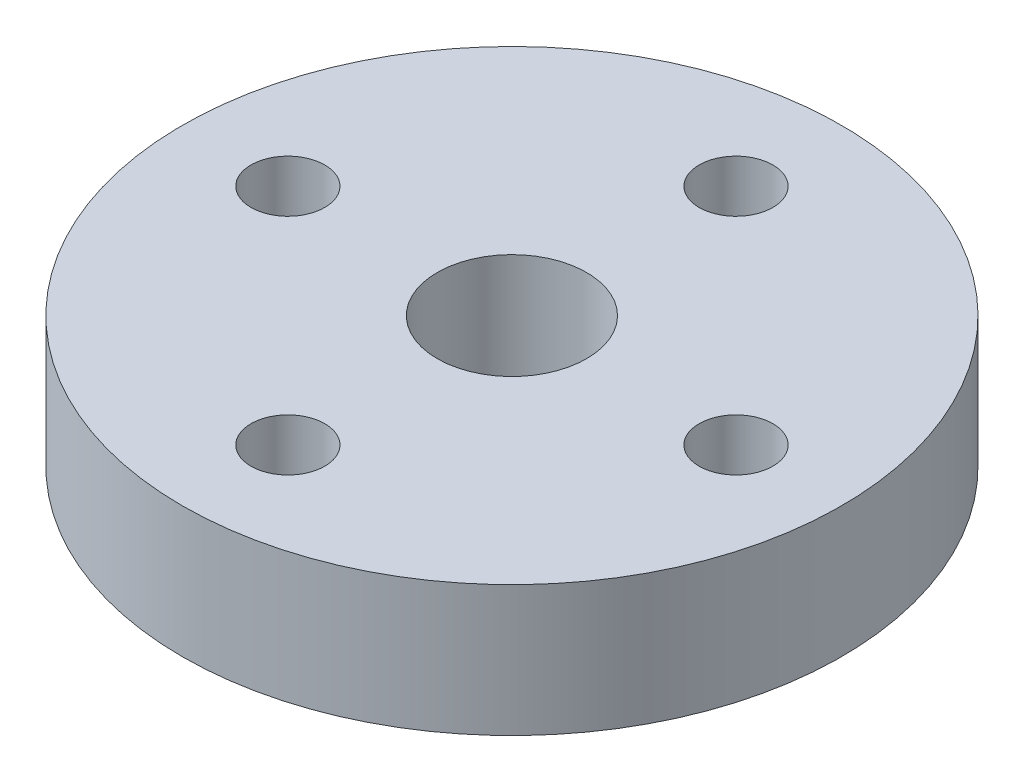
ISO-10303-21;
HEADER;
FILE_DESCRIPTION(('STEP AP214'),'2;1');
FILE_NAME('part.step','',(''),(''),'','','');
FILE_SCHEMA(('AUTOMOTIVE_DESIGN { 1 0 10303 214 1 1 1 1 }'));
ENDSEC;
DATA;
#1=APPLICATION_CONTEXT('core data for automotive mechanical design processes');
#2=APPLICATION_PROTOCOL_DEFINITION('international standard','automotive_design',2000,#1);
#3=PRODUCT_CONTEXT('',#1,'mechanical');
#4=PRODUCT('Part','Part','',(#3));
#5=PRODUCT_RELATED_PRODUCT_CATEGORY('part','',(#4));
#6=PRODUCT_DEFINITION_FORMATION('','',#4);
#7=PRODUCT_DEFINITION_CONTEXT('part definition',#1,'design');
#8=PRODUCT_DEFINITION('design','',#6,#7);
#9=PRODUCT_DEFINITION_SHAPE('','',#8);
#10=(LENGTH_UNIT() NAMED_UNIT(*) SI_UNIT(.MILLI.,.METRE.));
#11=(NAMED_UNIT(*) PLANE_ANGLE_UNIT() SI_UNIT($,.RADIAN.));
#12=(NAMED_UNIT(*) SI_UNIT($,.STERADIAN.) SOLID_ANGLE_UNIT());
#13=UNCERTAINTY_MEASURE_WITH_UNIT(LENGTH_MEASURE(1.E-05),#10,'distance_accuracy_value','');
#14=(GEOMETRIC_REPRESENTATION_CONTEXT(3) GLOBAL_UNCERTAINTY_ASSIGNED_CONTEXT((#13)) GLOBAL_UNIT_ASSIGNED_CONTEXT((#10,
#11,#12)) REPRESENTATION_CONTEXT('',''));
#15=CARTESIAN_POINT('',(0.,0.,0.));
#16=DIRECTION('',(0.,0.,1.));
#17=DIRECTION('',(1.,0.,0.));
#18=AXIS2_PLACEMENT_3D('',#15,#16,#17);
#19=CARTESIAN_POINT('',(0.,7.,0.));
#20=DIRECTION('',(0.,1.,0.));
#21=DIRECTION('',(0.,0.,1.));
#22=AXIS2_PLACEMENT_3D('',#19,#20,#21);
#23=PLANE('',#22);
#24=CARTESIAN_POINT('',(6.78404223294284E-13,7.,12.));
#25=DIRECTION('',(0.,1.,0.));
#26=DIRECTION('',(0.,0.,1.));
#27=AXIS2_PLACEMENT_3D('',#24,#25,#26);
#28=CIRCLE('',#27,1.975);
#29=CARTESIAN_POINT('',(6.78404223294284E-13,7.,13.975));
#30=VERTEX_POINT('',#29);
#31=EDGE_CURVE('E63',#30,#30,#28,.T.);
#32=ORIENTED_EDGE('',*,*,#31,.F.);
#33=EDGE_LOOP('',(#32));
#34=FACE_BOUND('',#33,.T.);
#35=CARTESIAN_POINT('',(0.,7.,-12.));
#36=DIRECTION('',(0.,1.,0.));
#37=DIRECTION('',(0.,0.,1.));
#38=AXIS2_PLACEMENT_3D('',#35,#36,#37);
#39=CIRCLE('',#38,1.975);
#40=CARTESIAN_POINT('',(0.,7.,-10.025));
#41=VERTEX_POINT('',#40);
#42=EDGE_CURVE('E51',#41,#41,#39,.T.);
#43=ORIENTED_EDGE('',*,*,#42,.F.);
#44=EDGE_LOOP('',(#43));
#45=FACE_BOUND('',#44,.T.);
#46=CARTESIAN_POINT('',(0.,7.,0.));
#47=DIRECTION('',(0.,1.,0.));
#48=DIRECTION('',(0.,0.,1.));
#49=AXIS2_PLACEMENT_3D('',#46,#47,#48);
#50=CIRCLE('',#49,17.65);
#51=CARTESIAN_POINT('',(0.,7.,17.65));
#52=VERTEX_POINT('',#51);
#53=EDGE_CURVE('E10',#52,#52,#50,.T.);
#54=ORIENTED_EDGE('',*,*,#53,.T.);
#55=EDGE_LOOP('',(#54));
#56=FACE_BOUND('',#55,.T.);
#57=CARTESIAN_POINT('',(0.,7.,0.));
#58=DIRECTION('',(0.,1.,0.));
#59=DIRECTION('',(0.,0.,1.));
#60=AXIS2_PLACEMENT_3D('',#57,#58,#59);
#61=CIRCLE('',#60,4.);
#62=CARTESIAN_POINT('',(0.,7.,4.));
#63=VERTEX_POINT('',#62);
#64=EDGE_CURVE('E46',#63,#63,#61,.T.);
#65=ORIENTED_EDGE('',*,*,#64,.F.);
#66=EDGE_LOOP('',(#65));
#67=FACE_BOUND('',#66,.T.);
#68=CARTESIAN_POINT('',(12.0000000000003,7.,-3.38856148926383E-13));
#69=DIRECTION('',(0.,1.,0.));
#70=DIRECTION('',(0.,0.,1.));
#71=AXIS2_PLACEMENT_3D('',#68,#69,#70);
#72=CIRCLE('',#71,1.975);
#73=CARTESIAN_POINT('',(12.0000000000003,7.,1.97499999999966));
#74=VERTEX_POINT('',#73);
#75=EDGE_CURVE('E57',#74,#74,#72,.T.);
#76=ORIENTED_EDGE('',*,*,#75,.F.);
#77=EDGE_LOOP('',(#76));
#78=FACE_BOUND('',#77,.T.);
#79=CARTESIAN_POINT('',(-11.9999999999997,7.,3.4032572508536E-13));
#80=DIRECTION('',(0.,1.,0.));
#81=DIRECTION('',(0.,0.,1.));
#82=AXIS2_PLACEMENT_3D('',#79,#80,#81);
#83=CIRCLE('',#82,1.975);
#84=CARTESIAN_POINT('',(-11.9999999999997,7.,1.97500000000034));
#85=VERTEX_POINT('',#84);
#86=EDGE_CURVE('E69',#85,#85,#83,.T.);
#87=ORIENTED_EDGE('',*,*,#86,.F.);
#88=EDGE_LOOP('',(#87));
#89=FACE_BOUND('',#88,.T.);
#90=ADVANCED_FACE('F35',(#34,#45,#56,#67,#78,#89),#23,.T.);
#91=CARTESIAN_POINT('',(0.,0.,0.));
#92=DIRECTION('',(0.,1.,0.));
#93=DIRECTION('',(0.,0.,1.));
#94=AXIS2_PLACEMENT_3D('',#91,#92,#93);
#95=PLANE('',#94);
#96=CARTESIAN_POINT('',(0.,0.,0.));
#97=DIRECTION('',(0.,1.,0.));
#98=DIRECTION('',(0.,0.,1.));
#99=AXIS2_PLACEMENT_3D('',#96,#97,#98);
#100=CIRCLE('',#99,17.65);
#101=CARTESIAN_POINT('',(0.,0.,17.65));
#102=VERTEX_POINT('',#101);
#103=EDGE_CURVE('E39',#102,#102,#100,.T.);
#104=ORIENTED_EDGE('',*,*,#103,.F.);
#105=EDGE_LOOP('',(#104));
#106=FACE_BOUND('',#105,.T.);
#107=CARTESIAN_POINT('',(0.,0.,0.));
#108=DIRECTION('',(0.,1.,0.));
#109=DIRECTION('',(0.,0.,1.));
#110=AXIS2_PLACEMENT_3D('',#107,#108,#109);
#111=CIRCLE('',#110,4.);
#112=CARTESIAN_POINT('',(0.,0.,4.));
#113=VERTEX_POINT('',#112);
#114=EDGE_CURVE('E48',#113,#113,#111,.T.);
#115=ORIENTED_EDGE('',*,*,#114,.T.);
#116=EDGE_LOOP('',(#115));
#117=FACE_BOUND('',#116,.T.);
#118=CARTESIAN_POINT('',(0.,0.,-12.));
#119=DIRECTION('',(0.,1.,0.));
#120=DIRECTION('',(0.,0.,1.));
#121=AXIS2_PLACEMENT_3D('',#118,#119,#120);
#122=CIRCLE('',#121,1.975);
#123=CARTESIAN_POINT('',(0.,0.,-10.025));
#124=VERTEX_POINT('',#123);
#125=EDGE_CURVE('E54',#124,#124,#122,.T.);
#126=ORIENTED_EDGE('',*,*,#125,.T.);
#127=EDGE_LOOP('',(#126));
#128=FACE_BOUND('',#127,.T.);
#129=CARTESIAN_POINT('',(12.0000000000003,0.,-3.38856148926383E-13));
#130=DIRECTION('',(0.,1.,0.));
#131=DIRECTION('',(0.,0.,1.));
#132=AXIS2_PLACEMENT_3D('',#129,#130,#131);
#133=CIRCLE('',#132,1.975);
#134=CARTESIAN_POINT('',(12.0000000000003,0.,1.97499999999966));
#135=VERTEX_POINT('',#134);
#136=EDGE_CURVE('E60',#135,#135,#133,.T.);
#137=ORIENTED_EDGE('',*,*,#136,.T.);
#138=EDGE_LOOP('',(#137));
#139=FACE_BOUND('',#138,.T.);
#140=CARTESIAN_POINT('',(6.78404223294284E-13,0.,12.));
#141=DIRECTION('',(0.,1.,0.));
#142=DIRECTION('',(0.,0.,1.));
#143=AXIS2_PLACEMENT_3D('',#140,#141,#142);
#144=CIRCLE('',#143,1.975);
#145=CARTESIAN_POINT('',(6.78404223294284E-13,0.,13.975));
#146=VERTEX_POINT('',#145);
#147=EDGE_CURVE('E66',#146,#146,#144,.T.);
#148=ORIENTED_EDGE('',*,*,#147,.T.);
#149=EDGE_LOOP('',(#148));
#150=FACE_BOUND('',#149,.T.);
#151=CARTESIAN_POINT('',(-11.9999999999997,0.,3.4032572508536E-13));
#152=DIRECTION('',(0.,1.,0.));
#153=DIRECTION('',(0.,0.,1.));
#154=AXIS2_PLACEMENT_3D('',#151,#152,#153);
#155=CIRCLE('',#154,1.975);
#156=CARTESIAN_POINT('',(-11.9999999999997,0.,1.97500000000034));
#157=VERTEX_POINT('',#156);
#158=EDGE_CURVE('E72',#157,#157,#155,.T.);
#159=ORIENTED_EDGE('',*,*,#158,.T.);
#160=EDGE_LOOP('',(#159));
#161=FACE_BOUND('',#160,.T.);
#162=ADVANCED_FACE('F82',(#106,#117,#128,#139,#150,#161),#95,.F.);
#163=CARTESIAN_POINT('',(0.,7.,0.));
#164=DIRECTION('',(0.,-1.,0.));
#165=DIRECTION('',(0.,0.,-1.));
#166=AXIS2_PLACEMENT_3D('',#163,#164,#165);
#167=CYLINDRICAL_SURFACE('',#166,17.65);
#168=ORIENTED_EDGE('',*,*,#53,.F.);
#169=EDGE_LOOP('',(#168));
#170=FACE_BOUND('',#169,.T.);
#171=ORIENTED_EDGE('',*,*,#103,.T.);
#172=EDGE_LOOP('',(#171));
#173=FACE_BOUND('',#172,.T.);
#174=ADVANCED_FACE('F37',(#170,#173),#167,.T.);
#175=CARTESIAN_POINT('',(0.,7.,0.));
#176=DIRECTION('',(0.,-1.,0.));
#177=DIRECTION('',(0.,0.,-1.));
#178=AXIS2_PLACEMENT_3D('',#175,#176,#177);
#179=CYLINDRICAL_SURFACE('',#178,4.);
#180=ORIENTED_EDGE('',*,*,#64,.T.);
#181=EDGE_LOOP('',(#180));
#182=FACE_BOUND('',#181,.T.);
#183=ORIENTED_EDGE('',*,*,#114,.F.);
#184=EDGE_LOOP('',(#183));
#185=FACE_BOUND('',#184,.T.);
#186=ADVANCED_FACE('F92',(#182,#185),#179,.F.);
#187=CARTESIAN_POINT('',(0.,7.,-12.));
#188=DIRECTION('',(0.,-1.,0.));
#189=DIRECTION('',(0.,0.,-1.));
#190=AXIS2_PLACEMENT_3D('',#187,#188,#189);
#191=CYLINDRICAL_SURFACE('',#190,1.975);
#192=ORIENTED_EDGE('',*,*,#42,.T.);
#193=EDGE_LOOP('',(#192));
#194=FACE_BOUND('',#193,.T.);
#195=ORIENTED_EDGE('',*,*,#125,.F.);
#196=EDGE_LOOP('',(#195));
#197=FACE_BOUND('',#196,.T.);
#198=ADVANCED_FACE('F95',(#194,#197),#191,.F.);
#199=CARTESIAN_POINT('',(12.0000000000003,7.,-3.38856148926383E-13));
#200=DIRECTION('',(0.,-1.,0.));
#201=DIRECTION('',(0.,0.,-1.));
#202=AXIS2_PLACEMENT_3D('',#199,#200,#201);
#203=CYLINDRICAL_SURFACE('',#202,1.975);
#204=ORIENTED_EDGE('',*,*,#75,.T.);
#205=EDGE_LOOP('',(#204));
#206=FACE_BOUND('',#205,.T.);
#207=ORIENTED_EDGE('',*,*,#136,.F.);
#208=EDGE_LOOP('',(#207));
#209=FACE_BOUND('',#208,.T.);
#210=ADVANCED_FACE('F99',(#206,#209),#203,.F.);
#211=CARTESIAN_POINT('',(6.78404223294284E-13,7.,12.));
#212=DIRECTION('',(0.,-1.,0.));
#213=DIRECTION('',(0.,0.,-1.));
#214=AXIS2_PLACEMENT_3D('',#211,#212,#213);
#215=CYLINDRICAL_SURFACE('',#214,1.975);
#216=ORIENTED_EDGE('',*,*,#31,.T.);
#217=EDGE_LOOP('',(#216));
#218=FACE_BOUND('',#217,.T.);
#219=ORIENTED_EDGE('',*,*,#147,.F.);
#220=EDGE_LOOP('',(#219));
#221=FACE_BOUND('',#220,.T.);
#222=ADVANCED_FACE('F103',(#218,#221),#215,.F.);
#223=CARTESIAN_POINT('',(-11.9999999999997,7.,3.4032572508536E-13));
#224=DIRECTION('',(0.,-1.,0.));
#225=DIRECTION('',(0.,0.,-1.));
#226=AXIS2_PLACEMENT_3D('',#223,#224,#225);
#227=CYLINDRICAL_SURFACE('',#226,1.975);
#228=ORIENTED_EDGE('',*,*,#86,.T.);
#229=EDGE_LOOP('',(#228));
#230=FACE_BOUND('',#229,.T.);
#231=ORIENTED_EDGE('',*,*,#158,.F.);
#232=EDGE_LOOP('',(#231));
#233=FACE_BOUND('',#232,.T.);
#234=ADVANCED_FACE('F78',(#230,#233),#227,.F.);
#235=CLOSED_SHELL('',(#90,#162,#174,#186,#198,#210,#222,#234));
#236=MANIFOLD_SOLID_BREP('B2',#235);
#237=ADVANCED_BREP_SHAPE_REPRESENTATION('',(#18,#236),#14);
#238=SHAPE_DEFINITION_REPRESENTATION(#9,#237);
ENDSEC;
END-ISO-10303-21;
